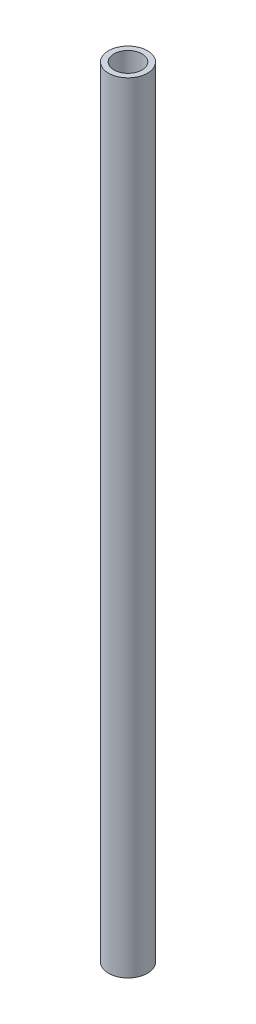
ISO-10303-21;
HEADER;
FILE_DESCRIPTION(('STEP AP214'),'2;1');
FILE_NAME('part.step','',(''),(''),'','','');
FILE_SCHEMA(('AUTOMOTIVE_DESIGN { 1 0 10303 214 1 1 1 1 }'));
ENDSEC;
DATA;
#1=APPLICATION_CONTEXT('core data for automotive mechanical design processes');
#2=APPLICATION_PROTOCOL_DEFINITION('international standard','automotive_design',2000,#1);
#3=PRODUCT_CONTEXT('',#1,'mechanical');
#4=PRODUCT('Part','Part','',(#3));
#5=PRODUCT_RELATED_PRODUCT_CATEGORY('part','',(#4));
#6=PRODUCT_DEFINITION_FORMATION('','',#4);
#7=PRODUCT_DEFINITION_CONTEXT('part definition',#1,'design');
#8=PRODUCT_DEFINITION('design','',#6,#7);
#9=PRODUCT_DEFINITION_SHAPE('','',#8);
#10=(LENGTH_UNIT() NAMED_UNIT(*) SI_UNIT(.MILLI.,.METRE.));
#11=(NAMED_UNIT(*) PLANE_ANGLE_UNIT() SI_UNIT($,.RADIAN.));
#12=(NAMED_UNIT(*) SI_UNIT($,.STERADIAN.) SOLID_ANGLE_UNIT());
#13=UNCERTAINTY_MEASURE_WITH_UNIT(LENGTH_MEASURE(1.E-05),#10,'distance_accuracy_value','');
#14=(GEOMETRIC_REPRESENTATION_CONTEXT(3) GLOBAL_UNCERTAINTY_ASSIGNED_CONTEXT((#13)) GLOBAL_UNIT_ASSIGNED_CONTEXT((#10,
#11,#12)) REPRESENTATION_CONTEXT('',''));
#15=CARTESIAN_POINT('',(0.,0.,0.));
#16=DIRECTION('',(0.,0.,1.));
#17=DIRECTION('',(1.,0.,0.));
#18=AXIS2_PLACEMENT_3D('',#15,#16,#17);
#19=CARTESIAN_POINT('',(0.,127.,0.));
#20=DIRECTION('',(0.,1.,0.));
#21=DIRECTION('',(0.,0.,1.));
#22=AXIS2_PLACEMENT_3D('',#19,#20,#21);
#23=PLANE('',#22);
#24=CARTESIAN_POINT('',(0.,127.,0.));
#25=DIRECTION('',(0.,1.,0.));
#26=DIRECTION('',(0.,0.,1.));
#27=AXIS2_PLACEMENT_3D('',#24,#25,#26);
#28=CIRCLE('',#27,3.175);
#29=CARTESIAN_POINT('',(0.,127.,3.175));
#30=VERTEX_POINT('',#29);
#31=EDGE_CURVE('E10',#30,#30,#28,.T.);
#32=ORIENTED_EDGE('',*,*,#31,.T.);
#33=EDGE_LOOP('',(#32));
#34=FACE_BOUND('',#33,.T.);
#35=CARTESIAN_POINT('',(0.,127.,0.));
#36=DIRECTION('',(0.,1.,0.));
#37=DIRECTION('',(0.,0.,1.));
#38=AXIS2_PLACEMENT_3D('',#35,#36,#37);
#39=CIRCLE('',#38,2.286);
#40=CARTESIAN_POINT('',(0.,127.,2.286));
#41=VERTEX_POINT('',#40);
#42=EDGE_CURVE('E50',#41,#41,#39,.T.);
#43=ORIENTED_EDGE('',*,*,#42,.F.);
#44=EDGE_LOOP('',(#43));
#45=FACE_BOUND('',#44,.T.);
#46=ADVANCED_FACE('F37',(#34,#45),#23,.T.);
#47=CARTESIAN_POINT('',(0.,0.,0.));
#48=DIRECTION('',(0.,1.,0.));
#49=DIRECTION('',(0.,0.,1.));
#50=AXIS2_PLACEMENT_3D('',#47,#48,#49);
#51=PLANE('',#50);
#52=CARTESIAN_POINT('',(0.,0.,0.));
#53=DIRECTION('',(0.,1.,0.));
#54=DIRECTION('',(0.,0.,1.));
#55=AXIS2_PLACEMENT_3D('',#52,#53,#54);
#56=CIRCLE('',#55,3.175);
#57=CARTESIAN_POINT('',(0.,0.,3.175));
#58=VERTEX_POINT('',#57);
#59=EDGE_CURVE('E41',#58,#58,#56,.T.);
#60=ORIENTED_EDGE('',*,*,#59,.F.);
#61=EDGE_LOOP('',(#60));
#62=FACE_BOUND('',#61,.T.);
#63=CARTESIAN_POINT('',(0.,0.,0.));
#64=DIRECTION('',(0.,1.,0.));
#65=DIRECTION('',(0.,0.,1.));
#66=AXIS2_PLACEMENT_3D('',#63,#64,#65);
#67=CIRCLE('',#66,2.286);
#68=CARTESIAN_POINT('',(0.,0.,2.286));
#69=VERTEX_POINT('',#68);
#70=EDGE_CURVE('E52',#69,#69,#67,.T.);
#71=ORIENTED_EDGE('',*,*,#70,.T.);
#72=EDGE_LOOP('',(#71));
#73=FACE_BOUND('',#72,.T.);
#74=ADVANCED_FACE('F64',(#62,#73),#51,.F.);
#75=CARTESIAN_POINT('',(0.,127.,0.));
#76=DIRECTION('',(0.,-1.,0.));
#77=DIRECTION('',(0.,0.,-1.));
#78=AXIS2_PLACEMENT_3D('',#75,#76,#77);
#79=CYLINDRICAL_SURFACE('',#78,3.175);
#80=ORIENTED_EDGE('',*,*,#31,.F.);
#81=EDGE_LOOP('',(#80));
#82=FACE_BOUND('',#81,.T.);
#83=ORIENTED_EDGE('',*,*,#59,.T.);
#84=EDGE_LOOP('',(#83));
#85=FACE_BOUND('',#84,.T.);
#86=ADVANCED_FACE('F39',(#82,#85),#79,.T.);
#87=CARTESIAN_POINT('',(0.,127.,0.));
#88=DIRECTION('',(0.,-1.,0.));
#89=DIRECTION('',(0.,0.,-1.));
#90=AXIS2_PLACEMENT_3D('',#87,#88,#89);
#91=CYLINDRICAL_SURFACE('',#90,2.286);
#92=ORIENTED_EDGE('',*,*,#42,.T.);
#93=EDGE_LOOP('',(#92));
#94=FACE_BOUND('',#93,.T.);
#95=ORIENTED_EDGE('',*,*,#70,.F.);
#96=EDGE_LOOP('',(#95));
#97=FACE_BOUND('',#96,.T.);
#98=ADVANCED_FACE('F60',(#94,#97),#91,.F.);
#99=CLOSED_SHELL('',(#46,#74,#86,#98));
#100=MANIFOLD_SOLID_BREP('B2',#99);
#101=ADVANCED_BREP_SHAPE_REPRESENTATION('',(#18,#100),#14);
#102=SHAPE_DEFINITION_REPRESENTATION(#9,#101);
ENDSEC;
END-ISO-10303-21;
